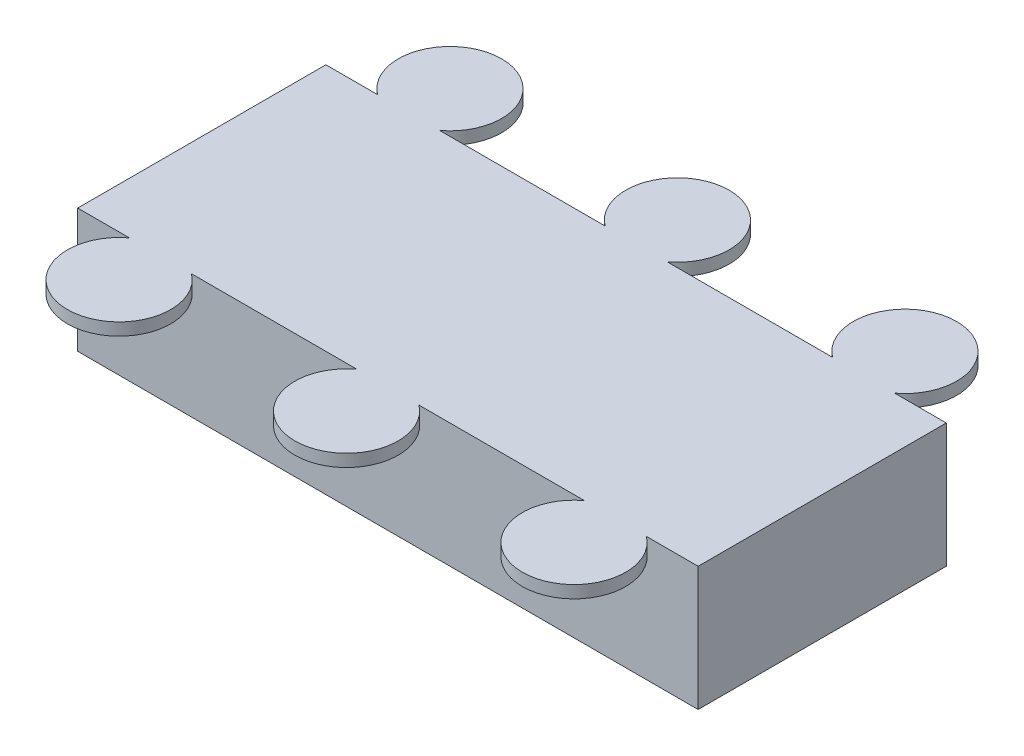
ISO-10303-21;
HEADER;
FILE_DESCRIPTION(('STEP AP214'),'2;1');
FILE_NAME('part.step','',(''),(''),'','','');
FILE_SCHEMA(('AUTOMOTIVE_DESIGN { 1 0 10303 214 1 1 1 1 }'));
ENDSEC;
DATA;
#1=APPLICATION_CONTEXT('core data for automotive mechanical design processes');
#2=APPLICATION_PROTOCOL_DEFINITION('international standard','automotive_design',2000,#1);
#3=PRODUCT_CONTEXT('',#1,'mechanical');
#4=PRODUCT('Part','Part','',(#3));
#5=PRODUCT_RELATED_PRODUCT_CATEGORY('part','',(#4));
#6=PRODUCT_DEFINITION_FORMATION('','',#4);
#7=PRODUCT_DEFINITION_CONTEXT('part definition',#1,'design');
#8=PRODUCT_DEFINITION('design','',#6,#7);
#9=PRODUCT_DEFINITION_SHAPE('','',#8);
#10=(LENGTH_UNIT() NAMED_UNIT(*) SI_UNIT(.MILLI.,.METRE.));
#11=(NAMED_UNIT(*) PLANE_ANGLE_UNIT() SI_UNIT($,.RADIAN.));
#12=(NAMED_UNIT(*) SI_UNIT($,.STERADIAN.) SOLID_ANGLE_UNIT());
#13=UNCERTAINTY_MEASURE_WITH_UNIT(LENGTH_MEASURE(1.E-05),#10,'distance_accuracy_value','');
#14=(GEOMETRIC_REPRESENTATION_CONTEXT(3) GLOBAL_UNCERTAINTY_ASSIGNED_CONTEXT((#13)) GLOBAL_UNIT_ASSIGNED_CONTEXT((#10,
#11,#12)) REPRESENTATION_CONTEXT('',''));
#15=CARTESIAN_POINT('',(0.,0.,0.));
#16=DIRECTION('',(0.,0.,1.));
#17=DIRECTION('',(1.,0.,0.));
#18=AXIS2_PLACEMENT_3D('',#15,#16,#17);
#19=CARTESIAN_POINT('',(750.,300.,-300.));
#20=DIRECTION('',(-1.,0.,0.));
#21=DIRECTION('',(0.,0.,1.));
#22=AXIS2_PLACEMENT_3D('',#19,#20,#21);
#23=PLANE('',#22);
#24=DIRECTION('',(0.,0.,-1.));
#25=VECTOR('',#24,1.);
#26=CARTESIAN_POINT('',(750.,0.,-300.));
#27=LINE('',#26,#25);
#28=CARTESIAN_POINT('',(750.,0.,300.));
#29=VERTEX_POINT('',#28);
#30=CARTESIAN_POINT('',(750.,0.,-300.));
#31=VERTEX_POINT('',#30);
#32=EDGE_CURVE('E226',#29,#31,#27,.T.);
#33=ORIENTED_EDGE('',*,*,#32,.T.);
#34=DIRECTION('',(0.,-1.,0.));
#35=VECTOR('',#34,1.);
#36=CARTESIAN_POINT('',(750.,300.,-300.));
#37=LINE('',#36,#35);
#38=CARTESIAN_POINT('',(750.,300.,-300.));
#39=VERTEX_POINT('',#38);
#40=EDGE_CURVE('E11',#39,#31,#37,.T.);
#41=ORIENTED_EDGE('',*,*,#40,.F.);
#42=DIRECTION('',(0.,0.,-1.));
#43=VECTOR('',#42,1.);
#44=CARTESIAN_POINT('',(750.,300.,-300.));
#45=LINE('',#44,#43);
#46=CARTESIAN_POINT('',(750.,300.,300.));
#47=VERTEX_POINT('',#46);
#48=EDGE_CURVE('E229',#47,#39,#45,.T.);
#49=ORIENTED_EDGE('',*,*,#48,.F.);
#50=DIRECTION('',(0.,-1.,0.));
#51=VECTOR('',#50,1.);
#52=CARTESIAN_POINT('',(750.,300.,300.));
#53=LINE('',#52,#51);
#54=EDGE_CURVE('E243',#47,#29,#53,.T.);
#55=ORIENTED_EDGE('',*,*,#54,.T.);
#56=EDGE_LOOP('',(#33,#41,#49,#55));
#57=FACE_BOUND('',#56,.T.);
#58=ADVANCED_FACE('F33',(#57),#23,.F.);
#59=CARTESIAN_POINT('',(-750.,300.,-300.));
#60=DIRECTION('',(0.,0.,1.));
#61=DIRECTION('',(1.,0.,0.));
#62=AXIS2_PLACEMENT_3D('',#59,#60,#61);
#63=PLANE('',#62);
#64=DIRECTION('',(1.,0.,0.));
#65=VECTOR('',#64,1.);
#66=CARTESIAN_POINT('',(-475.,270.,-300.));
#67=LINE('',#66,#65);
#68=CARTESIAN_POINT('',(-625.,270.,-300.));
#69=VERTEX_POINT('',#68);
#70=CARTESIAN_POINT('',(-475.,270.,-300.));
#71=VERTEX_POINT('',#70);
#72=EDGE_CURVE('E153',#69,#71,#67,.T.);
#73=ORIENTED_EDGE('',*,*,#72,.T.);
#74=DIRECTION('',(0.,1.,0.));
#75=VECTOR('',#74,1.);
#76=CARTESIAN_POINT('',(-475.,270.,-300.));
#77=LINE('',#76,#75);
#78=CARTESIAN_POINT('',(-475.,300.,-300.));
#79=VERTEX_POINT('',#78);
#80=EDGE_CURVE('E150',#71,#79,#77,.T.);
#81=ORIENTED_EDGE('',*,*,#80,.T.);
#82=DIRECTION('',(-1.,0.,0.));
#83=VECTOR('',#82,1.);
#84=CARTESIAN_POINT('',(-750.,300.,-300.));
#85=LINE('',#84,#83);
#86=CARTESIAN_POINT('',(-75.0000000000001,300.,-300.));
#87=VERTEX_POINT('',#86);
#88=EDGE_CURVE('E238',#87,#79,#85,.T.);
#89=ORIENTED_EDGE('',*,*,#88,.F.);
#90=DIRECTION('',(0.,1.,0.));
#91=VECTOR('',#90,1.);
#92=CARTESIAN_POINT('',(-75.,270.,-300.));
#93=LINE('',#92,#91);
#94=CARTESIAN_POINT('',(-75.,270.,-300.));
#95=VERTEX_POINT('',#94);
#96=EDGE_CURVE('E221',#95,#87,#93,.T.);
#97=ORIENTED_EDGE('',*,*,#96,.F.);
#98=DIRECTION('',(1.,0.,0.));
#99=VECTOR('',#98,1.);
#100=CARTESIAN_POINT('',(-75.,270.,-300.));
#101=LINE('',#100,#99);
#102=CARTESIAN_POINT('',(75.,270.,-300.));
#103=VERTEX_POINT('',#102);
#104=EDGE_CURVE('E218',#95,#103,#101,.T.);
#105=ORIENTED_EDGE('',*,*,#104,.T.);
#106=DIRECTION('',(0.,1.,0.));
#107=VECTOR('',#106,1.);
#108=CARTESIAN_POINT('',(75.,270.,-300.));
#109=LINE('',#108,#107);
#110=CARTESIAN_POINT('',(75.,300.,-300.));
#111=VERTEX_POINT('',#110);
#112=EDGE_CURVE('E223',#103,#111,#109,.T.);
#113=ORIENTED_EDGE('',*,*,#112,.T.);
#114=CARTESIAN_POINT('',(475.,300.,-300.));
#115=VERTEX_POINT('',#114);
#116=EDGE_CURVE('E237',#115,#111,#85,.T.);
#117=ORIENTED_EDGE('',*,*,#116,.F.);
#118=DIRECTION('',(0.,1.,0.));
#119=VECTOR('',#118,1.);
#120=CARTESIAN_POINT('',(475.,270.,-300.));
#121=LINE('',#120,#119);
#122=CARTESIAN_POINT('',(475.,270.,-300.));
#123=VERTEX_POINT('',#122);
#124=EDGE_CURVE('E182',#123,#115,#121,.T.);
#125=ORIENTED_EDGE('',*,*,#124,.F.);
#126=DIRECTION('',(1.,0.,0.));
#127=VECTOR('',#126,1.);
#128=CARTESIAN_POINT('',(625.000000000001,270.,-300.));
#129=LINE('',#128,#127);
#130=CARTESIAN_POINT('',(625.000000000001,270.,-300.));
#131=VERTEX_POINT('',#130);
#132=EDGE_CURVE('E179',#123,#131,#129,.T.);
#133=ORIENTED_EDGE('',*,*,#132,.T.);
#134=DIRECTION('',(0.,1.,0.));
#135=VECTOR('',#134,1.);
#136=CARTESIAN_POINT('',(625.000000000001,270.,-300.));
#137=LINE('',#136,#135);
#138=CARTESIAN_POINT('',(625.000000000001,300.,-300.));
#139=VERTEX_POINT('',#138);
#140=EDGE_CURVE('E184',#131,#139,#137,.T.);
#141=ORIENTED_EDGE('',*,*,#140,.T.);
#142=EDGE_CURVE('E233',#39,#139,#85,.T.);
#143=ORIENTED_EDGE('',*,*,#142,.F.);
#144=ORIENTED_EDGE('',*,*,#40,.T.);
#145=DIRECTION('',(-1.,0.,0.));
#146=VECTOR('',#145,1.);
#147=CARTESIAN_POINT('',(-750.,0.,-300.));
#148=LINE('',#147,#146);
#149=CARTESIAN_POINT('',(-750.,0.,-300.));
#150=VERTEX_POINT('',#149);
#151=EDGE_CURVE('E248',#31,#150,#148,.T.);
#152=ORIENTED_EDGE('',*,*,#151,.T.);
#153=DIRECTION('',(0.,-1.,0.));
#154=VECTOR('',#153,1.);
#155=CARTESIAN_POINT('',(-750.,300.,-300.));
#156=LINE('',#155,#154);
#157=CARTESIAN_POINT('',(-750.,300.,-300.));
#158=VERTEX_POINT('',#157);
#159=EDGE_CURVE('E40',#158,#150,#156,.T.);
#160=ORIENTED_EDGE('',*,*,#159,.F.);
#161=CARTESIAN_POINT('',(-625.,300.,-300.));
#162=VERTEX_POINT('',#161);
#163=EDGE_CURVE('E160',#162,#158,#85,.T.);
#164=ORIENTED_EDGE('',*,*,#163,.F.);
#165=DIRECTION('',(0.,1.,0.));
#166=VECTOR('',#165,1.);
#167=CARTESIAN_POINT('',(-625.,270.,-300.));
#168=LINE('',#167,#166);
#169=EDGE_CURVE('E147',#69,#162,#168,.T.);
#170=ORIENTED_EDGE('',*,*,#169,.F.);
#171=EDGE_LOOP('',(#73,#81,#89,#97,#105,#113,#117,#125,#133,#141,#143,#144,#152,#160,#164,#170));
#172=FACE_BOUND('',#171,.T.);
#173=ADVANCED_FACE('F158',(#172),#63,.F.);
#174=CARTESIAN_POINT('',(-750.,300.,-300.));
#175=DIRECTION('',(1.,0.,0.));
#176=DIRECTION('',(0.,0.,-1.));
#177=AXIS2_PLACEMENT_3D('',#174,#175,#176);
#178=PLANE('',#177);
#179=DIRECTION('',(0.,0.,1.));
#180=VECTOR('',#179,1.);
#181=CARTESIAN_POINT('',(-750.,0.,-300.));
#182=LINE('',#181,#180);
#183=CARTESIAN_POINT('',(-750.,0.,300.));
#184=VERTEX_POINT('',#183);
#185=EDGE_CURVE('E250',#150,#184,#182,.T.);
#186=ORIENTED_EDGE('',*,*,#185,.T.);
#187=DIRECTION('',(0.,-1.,0.));
#188=VECTOR('',#187,1.);
#189=CARTESIAN_POINT('',(-750.,300.,300.));
#190=LINE('',#189,#188);
#191=CARTESIAN_POINT('',(-750.,300.,300.));
#192=VERTEX_POINT('',#191);
#193=EDGE_CURVE('E255',#192,#184,#190,.T.);
#194=ORIENTED_EDGE('',*,*,#193,.F.);
#195=DIRECTION('',(0.,0.,1.));
#196=VECTOR('',#195,1.);
#197=CARTESIAN_POINT('',(-750.,300.,-300.));
#198=LINE('',#197,#196);
#199=EDGE_CURVE('E236',#158,#192,#198,.T.);
#200=ORIENTED_EDGE('',*,*,#199,.F.);
#201=ORIENTED_EDGE('',*,*,#159,.T.);
#202=EDGE_LOOP('',(#186,#194,#200,#201));
#203=FACE_BOUND('',#202,.T.);
#204=ADVANCED_FACE('F261',(#203),#178,.F.);
#205=CARTESIAN_POINT('',(-750.,300.,300.));
#206=DIRECTION('',(0.,0.,-1.));
#207=DIRECTION('',(-1.,0.,0.));
#208=AXIS2_PLACEMENT_3D('',#205,#206,#207);
#209=PLANE('',#208);
#210=DIRECTION('',(-1.,0.,0.));
#211=VECTOR('',#210,1.);
#212=CARTESIAN_POINT('',(-475.,270.,300.));
#213=LINE('',#212,#211);
#214=CARTESIAN_POINT('',(-475.,270.,300.));
#215=VERTEX_POINT('',#214);
#216=CARTESIAN_POINT('',(-625.,270.,300.));
#217=VERTEX_POINT('',#216);
#218=EDGE_CURVE('E167',#215,#217,#213,.T.);
#219=ORIENTED_EDGE('',*,*,#218,.T.);
#220=DIRECTION('',(0.,1.,0.));
#221=VECTOR('',#220,1.);
#222=CARTESIAN_POINT('',(-625.,270.,300.));
#223=LINE('',#222,#221);
#224=CARTESIAN_POINT('',(-625.,300.,300.));
#225=VERTEX_POINT('',#224);
#226=EDGE_CURVE('E172',#217,#225,#223,.T.);
#227=ORIENTED_EDGE('',*,*,#226,.T.);
#228=DIRECTION('',(1.,0.,0.));
#229=VECTOR('',#228,1.);
#230=CARTESIAN_POINT('',(-750.,300.,300.));
#231=LINE('',#230,#229);
#232=EDGE_CURVE('E241',#192,#225,#231,.T.);
#233=ORIENTED_EDGE('',*,*,#232,.F.);
#234=ORIENTED_EDGE('',*,*,#193,.T.);
#235=DIRECTION('',(1.,0.,0.));
#236=VECTOR('',#235,1.);
#237=CARTESIAN_POINT('',(-750.,0.,300.));
#238=LINE('',#237,#236);
#239=EDGE_CURVE('E232',#184,#29,#238,.T.);
#240=ORIENTED_EDGE('',*,*,#239,.T.);
#241=ORIENTED_EDGE('',*,*,#54,.F.);
#242=CARTESIAN_POINT('',(625.000000000001,300.,300.));
#243=VERTEX_POINT('',#242);
#244=EDGE_CURVE('E240',#243,#47,#231,.T.);
#245=ORIENTED_EDGE('',*,*,#244,.F.);
#246=DIRECTION('',(0.,1.,0.));
#247=VECTOR('',#246,1.);
#248=CARTESIAN_POINT('',(625.000000000001,270.,300.));
#249=LINE('',#248,#247);
#250=CARTESIAN_POINT('',(625.000000000001,270.,300.));
#251=VERTEX_POINT('',#250);
#252=EDGE_CURVE('E195',#251,#243,#249,.T.);
#253=ORIENTED_EDGE('',*,*,#252,.F.);
#254=DIRECTION('',(-1.,0.,0.));
#255=VECTOR('',#254,1.);
#256=CARTESIAN_POINT('',(625.000000000001,270.,300.));
#257=LINE('',#256,#255);
#258=CARTESIAN_POINT('',(475.,270.,300.));
#259=VERTEX_POINT('',#258);
#260=EDGE_CURVE('E192',#251,#259,#257,.T.);
#261=ORIENTED_EDGE('',*,*,#260,.T.);
#262=DIRECTION('',(0.,1.,0.));
#263=VECTOR('',#262,1.);
#264=CARTESIAN_POINT('',(475.,270.,300.));
#265=LINE('',#264,#263);
#266=CARTESIAN_POINT('',(475.,300.,300.));
#267=VERTEX_POINT('',#266);
#268=EDGE_CURVE('E197',#259,#267,#265,.T.);
#269=ORIENTED_EDGE('',*,*,#268,.T.);
#270=CARTESIAN_POINT('',(75.0000000000001,300.,300.));
#271=VERTEX_POINT('',#270);
#272=EDGE_CURVE('E245',#271,#267,#231,.T.);
#273=ORIENTED_EDGE('',*,*,#272,.F.);
#274=DIRECTION('',(0.,1.,0.));
#275=VECTOR('',#274,1.);
#276=CARTESIAN_POINT('',(75.,270.,300.));
#277=LINE('',#276,#275);
#278=CARTESIAN_POINT('',(75.,270.,300.));
#279=VERTEX_POINT('',#278);
#280=EDGE_CURVE('E208',#279,#271,#277,.T.);
#281=ORIENTED_EDGE('',*,*,#280,.F.);
#282=DIRECTION('',(-1.,0.,0.));
#283=VECTOR('',#282,1.);
#284=CARTESIAN_POINT('',(-75.,270.,300.));
#285=LINE('',#284,#283);
#286=CARTESIAN_POINT('',(-75.,270.,300.));
#287=VERTEX_POINT('',#286);
#288=EDGE_CURVE('E205',#279,#287,#285,.T.);
#289=ORIENTED_EDGE('',*,*,#288,.T.);
#290=DIRECTION('',(0.,1.,0.));
#291=VECTOR('',#290,1.);
#292=CARTESIAN_POINT('',(-75.,270.,300.));
#293=LINE('',#292,#291);
#294=CARTESIAN_POINT('',(-75.,300.,300.));
#295=VERTEX_POINT('',#294);
#296=EDGE_CURVE('E210',#287,#295,#293,.T.);
#297=ORIENTED_EDGE('',*,*,#296,.T.);
#298=CARTESIAN_POINT('',(-475.,300.,300.));
#299=VERTEX_POINT('',#298);
#300=EDGE_CURVE('E244',#299,#295,#231,.T.);
#301=ORIENTED_EDGE('',*,*,#300,.F.);
#302=DIRECTION('',(0.,1.,0.));
#303=VECTOR('',#302,1.);
#304=CARTESIAN_POINT('',(-475.,270.,300.));
#305=LINE('',#304,#303);
#306=EDGE_CURVE('E170',#215,#299,#305,.T.);
#307=ORIENTED_EDGE('',*,*,#306,.F.);
#308=EDGE_LOOP('',(#219,#227,#233,#234,#240,#241,#245,#253,#261,#269,#273,#281,#289,#297,#301,#307));
#309=FACE_BOUND('',#308,.T.);
#310=ADVANCED_FACE('F269',(#309),#209,.F.);
#311=CARTESIAN_POINT('',(0.,300.,0.));
#312=DIRECTION('',(0.,1.,0.));
#313=DIRECTION('',(0.,0.,1.));
#314=AXIS2_PLACEMENT_3D('',#311,#312,#313);
#315=PLANE('',#314);
#316=ORIENTED_EDGE('',*,*,#48,.T.);
#317=ORIENTED_EDGE('',*,*,#142,.T.);
#318=CARTESIAN_POINT('',(550.,300.,-400.));
#319=DIRECTION('',(0.,1.,0.));
#320=DIRECTION('',(0.,0.,1.));
#321=AXIS2_PLACEMENT_3D('',#318,#319,#320);
#322=CIRCLE('',#321,125.);
#323=EDGE_CURVE('E175',#139,#115,#322,.T.);
#324=ORIENTED_EDGE('',*,*,#323,.T.);
#325=ORIENTED_EDGE('',*,*,#116,.T.);
#326=CARTESIAN_POINT('',(0.,300.,-400.));
#327=DIRECTION('',(0.,1.,0.));
#328=DIRECTION('',(0.,0.,-1.));
#329=AXIS2_PLACEMENT_3D('',#326,#327,#328);
#330=CIRCLE('',#329,125.);
#331=EDGE_CURVE('E213',#111,#87,#330,.T.);
#332=ORIENTED_EDGE('',*,*,#331,.T.);
#333=ORIENTED_EDGE('',*,*,#88,.T.);
#334=CARTESIAN_POINT('',(-550.,300.,-400.));
#335=DIRECTION('',(0.,1.,0.));
#336=DIRECTION('',(0.,0.,1.));
#337=AXIS2_PLACEMENT_3D('',#334,#335,#336);
#338=CIRCLE('',#337,125.);
#339=EDGE_CURVE('E47',#79,#162,#338,.T.);
#340=ORIENTED_EDGE('',*,*,#339,.T.);
#341=ORIENTED_EDGE('',*,*,#163,.T.);
#342=ORIENTED_EDGE('',*,*,#199,.T.);
#343=ORIENTED_EDGE('',*,*,#232,.T.);
#344=CARTESIAN_POINT('',(-550.,300.,400.));
#345=DIRECTION('',(0.,1.,0.));
#346=DIRECTION('',(0.,0.,-1.));
#347=AXIS2_PLACEMENT_3D('',#344,#345,#346);
#348=CIRCLE('',#347,125.);
#349=EDGE_CURVE('E54',#225,#299,#348,.T.);
#350=ORIENTED_EDGE('',*,*,#349,.T.);
#351=ORIENTED_EDGE('',*,*,#300,.T.);
#352=CARTESIAN_POINT('',(0.,300.,400.));
#353=DIRECTION('',(0.,1.,0.));
#354=DIRECTION('',(0.,0.,1.));
#355=AXIS2_PLACEMENT_3D('',#352,#353,#354);
#356=CIRCLE('',#355,125.);
#357=EDGE_CURVE('E200',#295,#271,#356,.T.);
#358=ORIENTED_EDGE('',*,*,#357,.T.);
#359=ORIENTED_EDGE('',*,*,#272,.T.);
#360=CARTESIAN_POINT('',(550.,300.,400.));
#361=DIRECTION('',(0.,1.,0.));
#362=DIRECTION('',(0.,0.,-1.));
#363=AXIS2_PLACEMENT_3D('',#360,#361,#362);
#364=CIRCLE('',#363,125.);
#365=EDGE_CURVE('E187',#267,#243,#364,.T.);
#366=ORIENTED_EDGE('',*,*,#365,.T.);
#367=ORIENTED_EDGE('',*,*,#244,.T.);
#368=EDGE_LOOP('',(#316,#317,#324,#325,#332,#333,#340,#341,#342,#343,#350,#351,#358,#359,#366,#367));
#369=FACE_BOUND('',#368,.T.);
#370=ADVANCED_FACE('F275',(#369),#315,.T.);
#371=CARTESIAN_POINT('',(0.,0.,0.));
#372=DIRECTION('',(0.,1.,0.));
#373=DIRECTION('',(0.,0.,1.));
#374=AXIS2_PLACEMENT_3D('',#371,#372,#373);
#375=PLANE('',#374);
#376=ORIENTED_EDGE('',*,*,#32,.F.);
#377=ORIENTED_EDGE('',*,*,#239,.F.);
#378=ORIENTED_EDGE('',*,*,#185,.F.);
#379=ORIENTED_EDGE('',*,*,#151,.F.);
#380=EDGE_LOOP('',(#376,#377,#378,#379));
#381=FACE_BOUND('',#380,.T.);
#382=ADVANCED_FACE('F266',(#381),#375,.F.);
#383=CARTESIAN_POINT('',(0.,270.,-400.));
#384=DIRECTION('',(0.,1.,0.));
#385=DIRECTION('',(0.,0.,1.));
#386=AXIS2_PLACEMENT_3D('',#383,#384,#385);
#387=CYLINDRICAL_SURFACE('',#386,125.);
#388=ORIENTED_EDGE('',*,*,#331,.F.);
#389=ORIENTED_EDGE('',*,*,#112,.F.);
#390=CARTESIAN_POINT('',(0.,270.,-400.));
#391=DIRECTION('',(0.,1.,0.));
#392=DIRECTION('',(0.,0.,-1.));
#393=AXIS2_PLACEMENT_3D('',#390,#391,#392);
#394=CIRCLE('',#393,125.);
#395=EDGE_CURVE('E216',#103,#95,#394,.T.);
#396=ORIENTED_EDGE('',*,*,#395,.T.);
#397=ORIENTED_EDGE('',*,*,#96,.T.);
#398=EDGE_LOOP('',(#388,#389,#396,#397));
#399=FACE_BOUND('',#398,.T.);
#400=ADVANCED_FACE('F314',(#399),#387,.T.);
#401=CARTESIAN_POINT('',(0.,270.,-400.));
#402=DIRECTION('',(0.,-1.,0.));
#403=DIRECTION('',(0.,0.,-1.));
#404=AXIS2_PLACEMENT_3D('',#401,#402,#403);
#405=PLANE('',#404);
#406=ORIENTED_EDGE('',*,*,#395,.F.);
#407=ORIENTED_EDGE('',*,*,#104,.F.);
#408=EDGE_LOOP('',(#406,#407));
#409=FACE_BOUND('',#408,.T.);
#410=ADVANCED_FACE('F299',(#409),#405,.T.);
#411=CARTESIAN_POINT('',(0.,270.,400.));
#412=DIRECTION('',(0.,1.,0.));
#413=DIRECTION('',(0.,0.,1.));
#414=AXIS2_PLACEMENT_3D('',#411,#412,#413);
#415=CYLINDRICAL_SURFACE('',#414,125.);
#416=ORIENTED_EDGE('',*,*,#357,.F.);
#417=ORIENTED_EDGE('',*,*,#296,.F.);
#418=CARTESIAN_POINT('',(0.,270.,400.));
#419=DIRECTION('',(0.,1.,0.));
#420=DIRECTION('',(0.,0.,1.));
#421=AXIS2_PLACEMENT_3D('',#418,#419,#420);
#422=CIRCLE('',#421,125.);
#423=EDGE_CURVE('E203',#287,#279,#422,.T.);
#424=ORIENTED_EDGE('',*,*,#423,.T.);
#425=ORIENTED_EDGE('',*,*,#280,.T.);
#426=EDGE_LOOP('',(#416,#417,#424,#425));
#427=FACE_BOUND('',#426,.T.);
#428=ADVANCED_FACE('F282',(#427),#415,.T.);
#429=CARTESIAN_POINT('',(0.,270.,400.));
#430=DIRECTION('',(0.,1.,0.));
#431=DIRECTION('',(0.,0.,1.));
#432=AXIS2_PLACEMENT_3D('',#429,#430,#431);
#433=PLANE('',#432);
#434=ORIENTED_EDGE('',*,*,#423,.F.);
#435=ORIENTED_EDGE('',*,*,#288,.F.);
#436=EDGE_LOOP('',(#434,#435));
#437=FACE_BOUND('',#436,.T.);
#438=ADVANCED_FACE('F288',(#437),#433,.F.);
#439=CARTESIAN_POINT('',(550.,270.,400.));
#440=DIRECTION('',(0.,1.,0.));
#441=DIRECTION('',(0.,0.,1.));
#442=AXIS2_PLACEMENT_3D('',#439,#440,#441);
#443=CYLINDRICAL_SURFACE('',#442,125.);
#444=ORIENTED_EDGE('',*,*,#365,.F.);
#445=ORIENTED_EDGE('',*,*,#268,.F.);
#446=CARTESIAN_POINT('',(550.,270.,400.));
#447=DIRECTION('',(0.,1.,0.));
#448=DIRECTION('',(0.,0.,-1.));
#449=AXIS2_PLACEMENT_3D('',#446,#447,#448);
#450=CIRCLE('',#449,125.);
#451=EDGE_CURVE('E190',#259,#251,#450,.T.);
#452=ORIENTED_EDGE('',*,*,#451,.T.);
#453=ORIENTED_EDGE('',*,*,#252,.T.);
#454=EDGE_LOOP('',(#444,#445,#452,#453));
#455=FACE_BOUND('',#454,.T.);
#456=ADVANCED_FACE('F290',(#455),#443,.T.);
#457=CARTESIAN_POINT('',(550.,270.,400.));
#458=DIRECTION('',(0.,-1.,0.));
#459=DIRECTION('',(0.,0.,-1.));
#460=AXIS2_PLACEMENT_3D('',#457,#458,#459);
#461=PLANE('',#460);
#462=ORIENTED_EDGE('',*,*,#451,.F.);
#463=ORIENTED_EDGE('',*,*,#260,.F.);
#464=EDGE_LOOP('',(#462,#463));
#465=FACE_BOUND('',#464,.T.);
#466=ADVANCED_FACE('F296',(#465),#461,.T.);
#467=CARTESIAN_POINT('',(550.,270.,-400.));
#468=DIRECTION('',(0.,1.,0.));
#469=DIRECTION('',(0.,0.,1.));
#470=AXIS2_PLACEMENT_3D('',#467,#468,#469);
#471=CYLINDRICAL_SURFACE('',#470,125.);
#472=ORIENTED_EDGE('',*,*,#323,.F.);
#473=ORIENTED_EDGE('',*,*,#140,.F.);
#474=CARTESIAN_POINT('',(550.,270.,-400.));
#475=DIRECTION('',(0.,1.,0.));
#476=DIRECTION('',(0.,0.,1.));
#477=AXIS2_PLACEMENT_3D('',#474,#475,#476);
#478=CIRCLE('',#477,125.);
#479=EDGE_CURVE('E177',#131,#123,#478,.T.);
#480=ORIENTED_EDGE('',*,*,#479,.T.);
#481=ORIENTED_EDGE('',*,*,#124,.T.);
#482=EDGE_LOOP('',(#472,#473,#480,#481));
#483=FACE_BOUND('',#482,.T.);
#484=ADVANCED_FACE('F350',(#483),#471,.T.);
#485=CARTESIAN_POINT('',(550.,270.,-400.));
#486=DIRECTION('',(0.,1.,0.));
#487=DIRECTION('',(0.,0.,1.));
#488=AXIS2_PLACEMENT_3D('',#485,#486,#487);
#489=PLANE('',#488);
#490=ORIENTED_EDGE('',*,*,#479,.F.);
#491=ORIENTED_EDGE('',*,*,#132,.F.);
#492=EDGE_LOOP('',(#490,#491));
#493=FACE_BOUND('',#492,.T.);
#494=ADVANCED_FACE('F344',(#493),#489,.F.);
#495=CARTESIAN_POINT('',(-550.,270.,400.));
#496=DIRECTION('',(0.,1.,0.));
#497=DIRECTION('',(0.,0.,1.));
#498=AXIS2_PLACEMENT_3D('',#495,#496,#497);
#499=CYLINDRICAL_SURFACE('',#498,125.);
#500=ORIENTED_EDGE('',*,*,#349,.F.);
#501=ORIENTED_EDGE('',*,*,#226,.F.);
#502=CARTESIAN_POINT('',(-550.,270.,400.));
#503=DIRECTION('',(0.,1.,0.));
#504=DIRECTION('',(0.,0.,-1.));
#505=AXIS2_PLACEMENT_3D('',#502,#503,#504);
#506=CIRCLE('',#505,125.);
#507=EDGE_CURVE('E165',#217,#215,#506,.T.);
#508=ORIENTED_EDGE('',*,*,#507,.T.);
#509=ORIENTED_EDGE('',*,*,#306,.T.);
#510=EDGE_LOOP('',(#500,#501,#508,#509));
#511=FACE_BOUND('',#510,.T.);
#512=ADVANCED_FACE('F334',(#511),#499,.T.);
#513=CARTESIAN_POINT('',(-550.,270.,400.));
#514=DIRECTION('',(0.,-1.,0.));
#515=DIRECTION('',(0.,0.,-1.));
#516=AXIS2_PLACEMENT_3D('',#513,#514,#515);
#517=PLANE('',#516);
#518=ORIENTED_EDGE('',*,*,#507,.F.);
#519=ORIENTED_EDGE('',*,*,#218,.F.);
#520=EDGE_LOOP('',(#518,#519));
#521=FACE_BOUND('',#520,.T.);
#522=ADVANCED_FACE('F336',(#521),#517,.T.);
#523=CARTESIAN_POINT('',(-550.,270.,-400.));
#524=DIRECTION('',(0.,1.,0.));
#525=DIRECTION('',(0.,0.,1.));
#526=AXIS2_PLACEMENT_3D('',#523,#524,#525);
#527=CYLINDRICAL_SURFACE('',#526,125.);
#528=ORIENTED_EDGE('',*,*,#339,.F.);
#529=ORIENTED_EDGE('',*,*,#80,.F.);
#530=CARTESIAN_POINT('',(-550.,270.,-400.));
#531=DIRECTION('',(0.,1.,0.));
#532=DIRECTION('',(0.,0.,1.));
#533=AXIS2_PLACEMENT_3D('',#530,#531,#532);
#534=CIRCLE('',#533,125.);
#535=EDGE_CURVE('E143',#71,#69,#534,.T.);
#536=ORIENTED_EDGE('',*,*,#535,.T.);
#537=ORIENTED_EDGE('',*,*,#169,.T.);
#538=EDGE_LOOP('',(#528,#529,#536,#537));
#539=FACE_BOUND('',#538,.T.);
#540=ADVANCED_FACE('F145',(#539),#527,.T.);
#541=CARTESIAN_POINT('',(-550.,270.,-400.));
#542=DIRECTION('',(0.,1.,0.));
#543=DIRECTION('',(0.,0.,1.));
#544=AXIS2_PLACEMENT_3D('',#541,#542,#543);
#545=PLANE('',#544);
#546=ORIENTED_EDGE('',*,*,#535,.F.);
#547=ORIENTED_EDGE('',*,*,#72,.F.);
#548=EDGE_LOOP('',(#546,#547));
#549=FACE_BOUND('',#548,.T.);
#550=ADVANCED_FACE('F155',(#549),#545,.F.);
#551=CLOSED_SHELL('',(#58,#173,#204,#310,#370,#382,#400,#410,#428,#438,#456,#466,#484,#494,#512,
#522,#540,#550));
#552=MANIFOLD_SOLID_BREP('B2',#551);
#553=ADVANCED_BREP_SHAPE_REPRESENTATION('',(#18,#552),#14);
#554=SHAPE_DEFINITION_REPRESENTATION(#9,#553);
ENDSEC;
END-ISO-10303-21;
